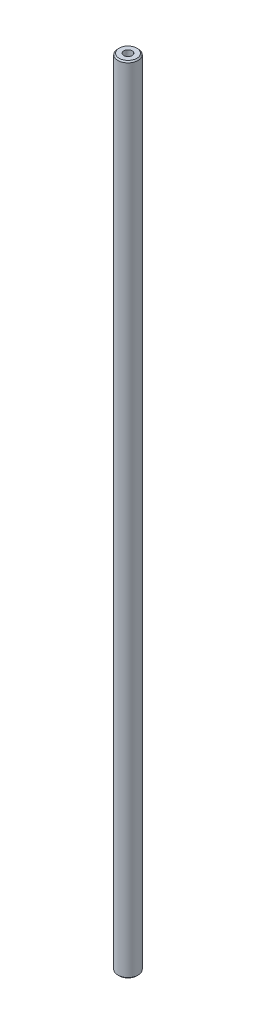
ISO-10303-21;
HEADER;
FILE_DESCRIPTION(('STEP AP214'),'2;1');
FILE_NAME('part.step','',(''),(''),'','','');
FILE_SCHEMA(('AUTOMOTIVE_DESIGN { 1 0 10303 214 1 1 1 1 }'));
ENDSEC;
DATA;
#1=APPLICATION_CONTEXT('core data for automotive mechanical design processes');
#2=APPLICATION_PROTOCOL_DEFINITION('international standard','automotive_design',2000,#1);
#3=PRODUCT_CONTEXT('',#1,'mechanical');
#4=PRODUCT('Part','Part','',(#3));
#5=PRODUCT_RELATED_PRODUCT_CATEGORY('part','',(#4));
#6=PRODUCT_DEFINITION_FORMATION('','',#4);
#7=PRODUCT_DEFINITION_CONTEXT('part definition',#1,'design');
#8=PRODUCT_DEFINITION('design','',#6,#7);
#9=PRODUCT_DEFINITION_SHAPE('','',#8);
#10=(LENGTH_UNIT() NAMED_UNIT(*) SI_UNIT(.MILLI.,.METRE.));
#11=(NAMED_UNIT(*) PLANE_ANGLE_UNIT() SI_UNIT($,.RADIAN.));
#12=(NAMED_UNIT(*) SI_UNIT($,.STERADIAN.) SOLID_ANGLE_UNIT());
#13=UNCERTAINTY_MEASURE_WITH_UNIT(LENGTH_MEASURE(1.E-05),#10,'distance_accuracy_value','');
#14=(GEOMETRIC_REPRESENTATION_CONTEXT(3) GLOBAL_UNCERTAINTY_ASSIGNED_CONTEXT((#13)) GLOBAL_UNIT_ASSIGNED_CONTEXT((#10,
#11,#12)) REPRESENTATION_CONTEXT('',''));
#15=CARTESIAN_POINT('',(0.,0.,0.));
#16=DIRECTION('',(0.,0.,1.));
#17=DIRECTION('',(1.,0.,0.));
#18=AXIS2_PLACEMENT_3D('',#15,#16,#17);
#19=CARTESIAN_POINT('',(0.,157.5,0.));
#20=DIRECTION('',(0.,-1.,0.));
#21=DIRECTION('',(0.,0.,-1.));
#22=AXIS2_PLACEMENT_3D('',#19,#20,#21);
#23=CYLINDRICAL_SURFACE('',#22,4.);
#24=CARTESIAN_POINT('',(0.,-157.,0.));
#25=DIRECTION('',(0.,1.,0.));
#26=DIRECTION('',(0.,0.,1.));
#27=AXIS2_PLACEMENT_3D('',#24,#25,#26);
#28=CIRCLE('',#27,4.);
#29=CARTESIAN_POINT('',(0.,-157.,4.));
#30=VERTEX_POINT('',#29);
#31=EDGE_CURVE('E48',#30,#30,#28,.T.);
#32=ORIENTED_EDGE('',*,*,#31,.T.);
#33=EDGE_LOOP('',(#32));
#34=FACE_BOUND('',#33,.T.);
#35=CARTESIAN_POINT('',(0.,157.,0.));
#36=DIRECTION('',(0.,1.,0.));
#37=DIRECTION('',(0.,0.,1.));
#38=AXIS2_PLACEMENT_3D('',#35,#36,#37);
#39=CIRCLE('',#38,4.);
#40=CARTESIAN_POINT('',(0.,157.,4.));
#41=VERTEX_POINT('',#40);
#42=EDGE_CURVE('E52',#41,#41,#39,.F.);
#43=ORIENTED_EDGE('',*,*,#42,.T.);
#44=EDGE_LOOP('',(#43));
#45=FACE_BOUND('',#44,.T.);
#46=ADVANCED_FACE('F37',(#34,#45),#23,.T.);
#47=CARTESIAN_POINT('',(0.,157.5,0.));
#48=DIRECTION('',(0.,1.,0.));
#49=DIRECTION('',(0.,0.,1.));
#50=AXIS2_PLACEMENT_3D('',#47,#48,#49);
#51=PLANE('',#50);
#52=CARTESIAN_POINT('',(0.,157.5,0.));
#53=DIRECTION('',(0.,1.,0.));
#54=DIRECTION('',(0.,0.,1.));
#55=AXIS2_PLACEMENT_3D('',#52,#53,#54);
#56=CIRCLE('',#55,1.65);
#57=CARTESIAN_POINT('',(0.,157.5,1.65));
#58=VERTEX_POINT('',#57);
#59=EDGE_CURVE('E58',#58,#58,#56,.T.);
#60=ORIENTED_EDGE('',*,*,#59,.F.);
#61=EDGE_LOOP('',(#60));
#62=FACE_BOUND('',#61,.T.);
#63=CARTESIAN_POINT('',(0.,157.5,0.));
#64=DIRECTION('',(0.,1.,0.));
#65=DIRECTION('',(0.,0.,1.));
#66=AXIS2_PLACEMENT_3D('',#63,#64,#65);
#67=CIRCLE('',#66,3.5);
#68=CARTESIAN_POINT('',(0.,157.5,3.5));
#69=VERTEX_POINT('',#68);
#70=EDGE_CURVE('E10',#69,#69,#67,.T.);
#71=ORIENTED_EDGE('',*,*,#70,.T.);
#72=EDGE_LOOP('',(#71));
#73=FACE_BOUND('',#72,.T.);
#74=ADVANCED_FACE('F82',(#62,#73),#51,.T.);
#75=CARTESIAN_POINT('',(0.,-157.5,0.));
#76=DIRECTION('',(0.,1.,0.));
#77=DIRECTION('',(0.,0.,1.));
#78=AXIS2_PLACEMENT_3D('',#75,#76,#77);
#79=PLANE('',#78);
#80=CARTESIAN_POINT('',(0.,-157.5,0.));
#81=DIRECTION('',(0.,-1.,0.));
#82=DIRECTION('',(0.,0.,-1.));
#83=AXIS2_PLACEMENT_3D('',#80,#81,#82);
#84=CIRCLE('',#83,1.65);
#85=CARTESIAN_POINT('',(0.,-157.5,-1.65));
#86=VERTEX_POINT('',#85);
#87=EDGE_CURVE('E64',#86,#86,#84,.T.);
#88=ORIENTED_EDGE('',*,*,#87,.F.);
#89=EDGE_LOOP('',(#88));
#90=FACE_BOUND('',#89,.T.);
#91=CARTESIAN_POINT('',(0.,-157.5,0.));
#92=DIRECTION('',(0.,1.,0.));
#93=DIRECTION('',(0.,0.,1.));
#94=AXIS2_PLACEMENT_3D('',#91,#92,#93);
#95=CIRCLE('',#94,3.49999999999995);
#96=CARTESIAN_POINT('',(0.,-157.5,3.49999999999995));
#97=VERTEX_POINT('',#96);
#98=EDGE_CURVE('E44',#97,#97,#95,.F.);
#99=ORIENTED_EDGE('',*,*,#98,.T.);
#100=EDGE_LOOP('',(#99));
#101=FACE_BOUND('',#100,.T.);
#102=ADVANCED_FACE('F79',(#90,#101),#79,.F.);
#103=CARTESIAN_POINT('',(0.,-157.,0.));
#104=DIRECTION('',(0.,1.,0.));
#105=DIRECTION('',(0.,0.,1.));
#106=AXIS2_PLACEMENT_3D('',#103,#104,#105);
#107=CONICAL_SURFACE('',#106,4.,0.7853981633975);
#108=ORIENTED_EDGE('',*,*,#98,.F.);
#109=EDGE_LOOP('',(#108));
#110=FACE_BOUND('',#109,.T.);
#111=ORIENTED_EDGE('',*,*,#31,.F.);
#112=EDGE_LOOP('',(#111));
#113=FACE_BOUND('',#112,.T.);
#114=ADVANCED_FACE('F81',(#110,#113),#107,.T.);
#115=CARTESIAN_POINT('',(0.,157.5,0.));
#116=DIRECTION('',(0.,-1.,0.));
#117=DIRECTION('',(0.,0.,-1.));
#118=AXIS2_PLACEMENT_3D('',#115,#116,#117);
#119=CONICAL_SURFACE('',#118,3.5,0.785398163397473);
#120=ORIENTED_EDGE('',*,*,#42,.F.);
#121=EDGE_LOOP('',(#120));
#122=FACE_BOUND('',#121,.T.);
#123=ORIENTED_EDGE('',*,*,#70,.F.);
#124=EDGE_LOOP('',(#123));
#125=FACE_BOUND('',#124,.T.);
#126=ADVANCED_FACE('F39',(#122,#125),#119,.T.);
#127=CARTESIAN_POINT('',(0.,145.5,0.));
#128=DIRECTION('',(0.,1.,0.));
#129=DIRECTION('',(0.,0.,1.));
#130=AXIS2_PLACEMENT_3D('',#127,#128,#129);
#131=CYLINDRICAL_SURFACE('',#130,1.65);
#132=CARTESIAN_POINT('',(0.,145.5,0.));
#133=DIRECTION('',(0.,1.,0.));
#134=DIRECTION('',(0.,0.,1.));
#135=AXIS2_PLACEMENT_3D('',#132,#133,#134);
#136=CIRCLE('',#135,1.65);
#137=CARTESIAN_POINT('',(0.,145.5,1.65));
#138=VERTEX_POINT('',#137);
#139=EDGE_CURVE('E57',#138,#138,#136,.T.);
#140=ORIENTED_EDGE('',*,*,#139,.F.);
#141=EDGE_LOOP('',(#140));
#142=FACE_BOUND('',#141,.T.);
#143=ORIENTED_EDGE('',*,*,#59,.T.);
#144=EDGE_LOOP('',(#143));
#145=FACE_BOUND('',#144,.T.);
#146=ADVANCED_FACE('F102',(#142,#145),#131,.F.);
#147=CARTESIAN_POINT('',(0.,145.5,0.));
#148=DIRECTION('',(0.,1.,0.));
#149=DIRECTION('',(0.,0.,1.));
#150=AXIS2_PLACEMENT_3D('',#147,#148,#149);
#151=PLANE('',#150);
#152=ORIENTED_EDGE('',*,*,#139,.T.);
#153=EDGE_LOOP('',(#152));
#154=FACE_BOUND('',#153,.T.);
#155=ADVANCED_FACE('F75',(#154),#151,.T.);
#156=CARTESIAN_POINT('',(0.,-145.5,0.));
#157=DIRECTION('',(0.,-1.,0.));
#158=DIRECTION('',(0.,0.,-1.));
#159=AXIS2_PLACEMENT_3D('',#156,#157,#158);
#160=CYLINDRICAL_SURFACE('',#159,1.65);
#161=CARTESIAN_POINT('',(0.,-145.5,0.));
#162=DIRECTION('',(0.,-1.,0.));
#163=DIRECTION('',(0.,0.,-1.));
#164=AXIS2_PLACEMENT_3D('',#161,#162,#163);
#165=CIRCLE('',#164,1.65);
#166=CARTESIAN_POINT('',(0.,-145.5,-1.65));
#167=VERTEX_POINT('',#166);
#168=EDGE_CURVE('E61',#167,#167,#165,.T.);
#169=ORIENTED_EDGE('',*,*,#168,.F.);
#170=EDGE_LOOP('',(#169));
#171=FACE_BOUND('',#170,.T.);
#172=ORIENTED_EDGE('',*,*,#87,.T.);
#173=EDGE_LOOP('',(#172));
#174=FACE_BOUND('',#173,.T.);
#175=ADVANCED_FACE('F72',(#171,#174),#160,.F.);
#176=CARTESIAN_POINT('',(0.,-145.5,0.));
#177=DIRECTION('',(0.,-1.,0.));
#178=DIRECTION('',(0.,0.,-1.));
#179=AXIS2_PLACEMENT_3D('',#176,#177,#178);
#180=PLANE('',#179);
#181=ORIENTED_EDGE('',*,*,#168,.T.);
#182=EDGE_LOOP('',(#181));
#183=FACE_BOUND('',#182,.T.);
#184=ADVANCED_FACE('F70',(#183),#180,.T.);
#185=CLOSED_SHELL('',(#46,#74,#102,#114,#126,#146,#155,#175,#184));
#186=MANIFOLD_SOLID_BREP('B2',#185);
#187=ADVANCED_BREP_SHAPE_REPRESENTATION('',(#18,#186),#14);
#188=SHAPE_DEFINITION_REPRESENTATION(#9,#187);
ENDSEC;
END-ISO-10303-21;
